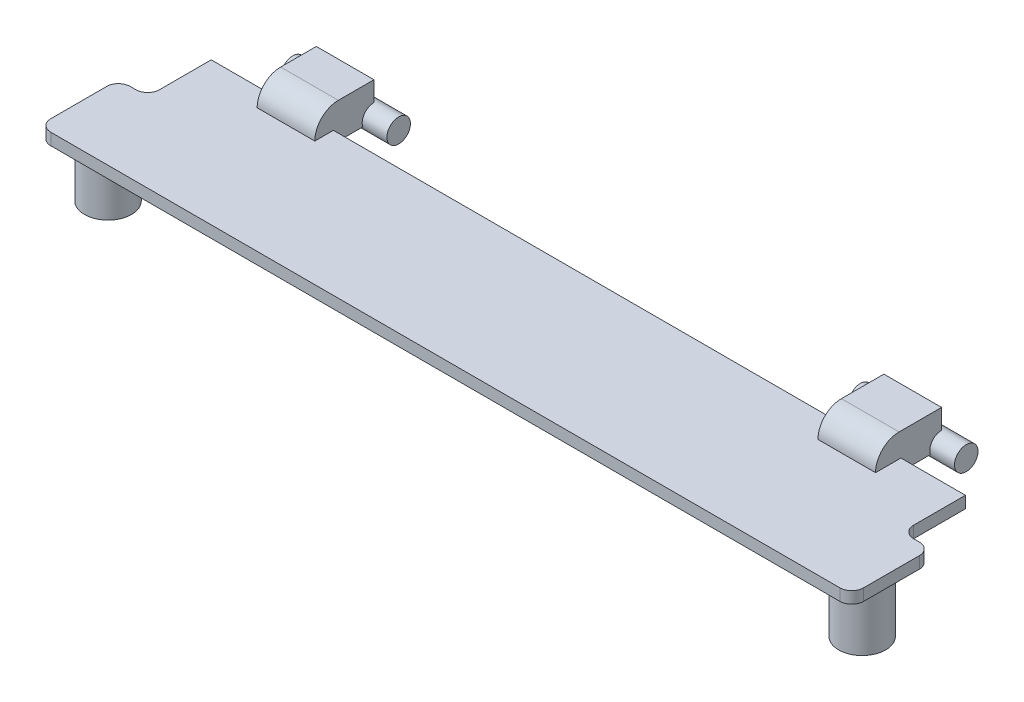
ISO-10303-21;
HEADER;
FILE_DESCRIPTION(('STEP AP214'),'2;1');
FILE_NAME('part.step','',(''),(''),'','','');
FILE_SCHEMA(('AUTOMOTIVE_DESIGN { 1 0 10303 214 1 1 1 1 }'));
ENDSEC;
DATA;
#1=APPLICATION_CONTEXT('core data for automotive mechanical design processes');
#2=APPLICATION_PROTOCOL_DEFINITION('international standard','automotive_design',2000,#1);
#3=PRODUCT_CONTEXT('',#1,'mechanical');
#4=PRODUCT('Part','Part','',(#3));
#5=PRODUCT_RELATED_PRODUCT_CATEGORY('part','',(#4));
#6=PRODUCT_DEFINITION_FORMATION('','',#4);
#7=PRODUCT_DEFINITION_CONTEXT('part definition',#1,'design');
#8=PRODUCT_DEFINITION('design','',#6,#7);
#9=PRODUCT_DEFINITION_SHAPE('','',#8);
#10=(LENGTH_UNIT() NAMED_UNIT(*) SI_UNIT(.MILLI.,.METRE.));
#11=(NAMED_UNIT(*) PLANE_ANGLE_UNIT() SI_UNIT($,.RADIAN.));
#12=(NAMED_UNIT(*) SI_UNIT($,.STERADIAN.) SOLID_ANGLE_UNIT());
#13=UNCERTAINTY_MEASURE_WITH_UNIT(LENGTH_MEASURE(1.E-05),#10,'distance_accuracy_value','');
#14=(GEOMETRIC_REPRESENTATION_CONTEXT(3) GLOBAL_UNCERTAINTY_ASSIGNED_CONTEXT((#13)) GLOBAL_UNIT_ASSIGNED_CONTEXT((#10,
#11,#12)) REPRESENTATION_CONTEXT('',''));
#15=CARTESIAN_POINT('',(0.,0.,0.));
#16=DIRECTION('',(0.,0.,1.));
#17=DIRECTION('',(1.,0.,0.));
#18=AXIS2_PLACEMENT_3D('',#15,#16,#17);
#19=CARTESIAN_POINT('',(0.,6.,-8.77306747824622));
#20=DIRECTION('',(0.,0.,1.));
#21=DIRECTION('',(1.,0.,0.));
#22=AXIS2_PLACEMENT_3D('',#19,#20,#21);
#23=PLANE('',#22);
#24=DIRECTION('',(-1.,0.,0.));
#25=VECTOR('',#24,1.);
#26=CARTESIAN_POINT('',(0.,6.,-8.77306747824622));
#27=LINE('',#26,#25);
#28=CARTESIAN_POINT('',(53.72,6.,-8.77306747824622));
#29=VERTEX_POINT('',#28);
#30=CARTESIAN_POINT('',(10.38,6.,-8.77306747824622));
#31=VERTEX_POINT('',#30);
#32=EDGE_CURVE('E284',#29,#31,#27,.T.);
#33=ORIENTED_EDGE('',*,*,#32,.F.);
#34=DIRECTION('',(0.,-1.,0.));
#35=VECTOR('',#34,1.);
#36=CARTESIAN_POINT('',(53.72,6.,-8.77306747824622));
#37=LINE('',#36,#35);
#38=CARTESIAN_POINT('',(53.72,5.,-8.77306747824622));
#39=VERTEX_POINT('',#38);
#40=EDGE_CURVE('E486',#29,#39,#37,.T.);
#41=ORIENTED_EDGE('',*,*,#40,.T.);
#42=DIRECTION('',(-1.,0.,0.));
#43=VECTOR('',#42,1.);
#44=CARTESIAN_POINT('',(0.,5.,-8.77306747824622));
#45=LINE('',#44,#43);
#46=CARTESIAN_POINT('',(10.38,5.,-8.77306747824622));
#47=VERTEX_POINT('',#46);
#48=EDGE_CURVE('E334',#39,#47,#45,.T.);
#49=ORIENTED_EDGE('',*,*,#48,.T.);
#50=DIRECTION('',(0.,1.,0.));
#51=VECTOR('',#50,1.);
#52=CARTESIAN_POINT('',(10.38,6.,-8.77306747824622));
#53=LINE('',#52,#51);
#54=EDGE_CURVE('E285',#47,#31,#53,.T.);
#55=ORIENTED_EDGE('',*,*,#54,.T.);
#56=EDGE_LOOP('',(#33,#41,#49,#55));
#57=FACE_BOUND('',#56,.T.);
#58=ADVANCED_FACE('F41',(#57),#23,.F.);
#59=CARTESIAN_POINT('',(64.1,5.,-8.77306747824622));
#60=VERTEX_POINT('',#59);
#61=CARTESIAN_POINT('',(58.62,5.,-8.77306747824622));
#62=VERTEX_POINT('',#61);
#63=EDGE_CURVE('E330',#60,#62,#45,.T.);
#64=ORIENTED_EDGE('',*,*,#63,.T.);
#65=DIRECTION('',(0.,1.,0.));
#66=VECTOR('',#65,1.);
#67=CARTESIAN_POINT('',(58.62,6.,-8.77306747824622));
#68=LINE('',#67,#66);
#69=CARTESIAN_POINT('',(58.62,6.,-8.77306747824622));
#70=VERTEX_POINT('',#69);
#71=EDGE_CURVE('E533',#62,#70,#68,.T.);
#72=ORIENTED_EDGE('',*,*,#71,.T.);
#73=CARTESIAN_POINT('',(64.1,6.,-8.77306747824622));
#74=VERTEX_POINT('',#73);
#75=EDGE_CURVE('E306',#74,#70,#27,.T.);
#76=ORIENTED_EDGE('',*,*,#75,.F.);
#77=DIRECTION('',(0.,-1.,0.));
#78=VECTOR('',#77,1.);
#79=CARTESIAN_POINT('',(64.1,6.,-8.77306747824622));
#80=LINE('',#79,#78);
#81=EDGE_CURVE('E353',#74,#60,#80,.T.);
#82=ORIENTED_EDGE('',*,*,#81,.T.);
#83=EDGE_LOOP('',(#64,#72,#76,#82));
#84=FACE_BOUND('',#83,.T.);
#85=ADVANCED_FACE('F558',(#84),#23,.F.);
#86=CARTESIAN_POINT('',(64.1,5.,0.));
#87=DIRECTION('',(0.,-1.,0.));
#88=DIRECTION('',(0.,0.,-1.));
#89=AXIS2_PLACEMENT_3D('',#86,#87,#88);
#90=CYLINDRICAL_SURFACE('',#89,2.);
#91=CARTESIAN_POINT('',(64.1,5.,0.));
#92=DIRECTION('',(0.,1.,0.));
#93=DIRECTION('',(0.,0.,1.));
#94=AXIS2_PLACEMENT_3D('',#91,#92,#93);
#95=CIRCLE('',#94,2.);
#96=CARTESIAN_POINT('',(64.1,5.,2.));
#97=VERTEX_POINT('',#96);
#98=EDGE_CURVE('E357',#97,#97,#95,.T.);
#99=ORIENTED_EDGE('',*,*,#98,.F.);
#100=EDGE_LOOP('',(#99));
#101=FACE_BOUND('',#100,.T.);
#102=CARTESIAN_POINT('',(64.1,0.,0.));
#103=DIRECTION('',(0.,1.,0.));
#104=DIRECTION('',(0.,0.,1.));
#105=AXIS2_PLACEMENT_3D('',#102,#103,#104);
#106=CIRCLE('',#105,2.);
#107=CARTESIAN_POINT('',(64.1,0.,2.));
#108=VERTEX_POINT('',#107);
#109=EDGE_CURVE('E356',#108,#108,#106,.T.);
#110=ORIENTED_EDGE('',*,*,#109,.T.);
#111=EDGE_LOOP('',(#110));
#112=FACE_BOUND('',#111,.T.);
#113=ADVANCED_FACE('F564',(#101,#112),#90,.T.);
#114=CARTESIAN_POINT('',(64.1,0.,0.));
#115=DIRECTION('',(0.,1.,0.));
#116=DIRECTION('',(0.,0.,1.));
#117=AXIS2_PLACEMENT_3D('',#114,#115,#116);
#118=PLANE('',#117);
#119=ORIENTED_EDGE('',*,*,#109,.F.);
#120=EDGE_LOOP('',(#119));
#121=FACE_BOUND('',#120,.T.);
#122=ADVANCED_FACE('F572',(#121),#118,.F.);
#123=CARTESIAN_POINT('',(64.1,6.,-3.37306747824622));
#124=DIRECTION('',(-1.,0.,0.));
#125=DIRECTION('',(0.,0.,1.));
#126=AXIS2_PLACEMENT_3D('',#123,#124,#125);
#127=PLANE('',#126);
#128=DIRECTION('',(0.,0.,-1.));
#129=VECTOR('',#128,1.);
#130=CARTESIAN_POINT('',(64.1,6.,-3.37306747824622));
#131=LINE('',#130,#129);
#132=CARTESIAN_POINT('',(64.1,6.,-4.37306747824622));
#133=VERTEX_POINT('',#132);
#134=EDGE_CURVE('E302',#133,#74,#131,.T.);
#135=ORIENTED_EDGE('',*,*,#134,.F.);
#136=DIRECTION('',(0.,-1.,0.));
#137=VECTOR('',#136,1.);
#138=CARTESIAN_POINT('',(64.1,5.,-4.37306747824622));
#139=LINE('',#138,#137);
#140=CARTESIAN_POINT('',(64.1,5.,-4.37306747824622));
#141=VERTEX_POINT('',#140);
#142=EDGE_CURVE('E369',#133,#141,#139,.T.);
#143=ORIENTED_EDGE('',*,*,#142,.T.);
#144=DIRECTION('',(0.,0.,-1.));
#145=VECTOR('',#144,1.);
#146=CARTESIAN_POINT('',(64.1,5.,-3.37306747824622));
#147=LINE('',#146,#145);
#148=EDGE_CURVE('E299',#141,#60,#147,.T.);
#149=ORIENTED_EDGE('',*,*,#148,.T.);
#150=ORIENTED_EDGE('',*,*,#81,.F.);
#151=EDGE_LOOP('',(#135,#143,#149,#150));
#152=FACE_BOUND('',#151,.T.);
#153=ADVANCED_FACE('F422',(#152),#127,.F.);
#154=CARTESIAN_POINT('',(5.48,6.,-8.77306747824622));
#155=VERTEX_POINT('',#154);
#156=CARTESIAN_POINT('',(0.,6.,-8.77306747824622));
#157=VERTEX_POINT('',#156);
#158=EDGE_CURVE('E304',#155,#157,#27,.T.);
#159=ORIENTED_EDGE('',*,*,#158,.F.);
#160=DIRECTION('',(0.,-1.,0.));
#161=VECTOR('',#160,1.);
#162=CARTESIAN_POINT('',(5.48,6.,-8.77306747824622));
#163=LINE('',#162,#161);
#164=CARTESIAN_POINT('',(5.48,5.,-8.77306747824622));
#165=VERTEX_POINT('',#164);
#166=EDGE_CURVE('E287',#155,#165,#163,.T.);
#167=ORIENTED_EDGE('',*,*,#166,.T.);
#168=CARTESIAN_POINT('',(0.,5.,-8.77306747824622));
#169=VERTEX_POINT('',#168);
#170=EDGE_CURVE('E329',#165,#169,#45,.T.);
#171=ORIENTED_EDGE('',*,*,#170,.T.);
#172=DIRECTION('',(0.,-1.,0.));
#173=VECTOR('',#172,1.);
#174=CARTESIAN_POINT('',(0.,6.,-8.77306747824622));
#175=LINE('',#174,#173);
#176=EDGE_CURVE('E327',#157,#169,#175,.T.);
#177=ORIENTED_EDGE('',*,*,#176,.F.);
#178=EDGE_LOOP('',(#159,#167,#171,#177));
#179=FACE_BOUND('',#178,.T.);
#180=ADVANCED_FACE('F481',(#179),#23,.F.);
#181=CARTESIAN_POINT('',(0.,6.,-3.37306747824622));
#182=DIRECTION('',(1.,0.,0.));
#183=DIRECTION('',(0.,0.,-1.));
#184=AXIS2_PLACEMENT_3D('',#181,#182,#183);
#185=PLANE('',#184);
#186=DIRECTION('',(0.,0.,1.));
#187=VECTOR('',#186,1.);
#188=CARTESIAN_POINT('',(0.,5.,-3.37306747824622));
#189=LINE('',#188,#187);
#190=CARTESIAN_POINT('',(0.,5.,-4.37306747824622));
#191=VERTEX_POINT('',#190);
#192=EDGE_CURVE('E333',#169,#191,#189,.T.);
#193=ORIENTED_EDGE('',*,*,#192,.T.);
#194=DIRECTION('',(0.,-1.,0.));
#195=VECTOR('',#194,1.);
#196=CARTESIAN_POINT('',(0.,6.,-4.37306747824622));
#197=LINE('',#196,#195);
#198=CARTESIAN_POINT('',(0.,6.,-4.37306747824622));
#199=VERTEX_POINT('',#198);
#200=EDGE_CURVE('E367',#191,#199,#197,.F.);
#201=ORIENTED_EDGE('',*,*,#200,.T.);
#202=DIRECTION('',(0.,0.,1.));
#203=VECTOR('',#202,1.);
#204=CARTESIAN_POINT('',(0.,6.,-3.37306747824622));
#205=LINE('',#204,#203);
#206=EDGE_CURVE('E309',#157,#199,#205,.T.);
#207=ORIENTED_EDGE('',*,*,#206,.F.);
#208=ORIENTED_EDGE('',*,*,#176,.T.);
#209=EDGE_LOOP('',(#193,#201,#207,#208));
#210=FACE_BOUND('',#209,.T.);
#211=ADVANCED_FACE('F476',(#210),#185,.F.);
#212=CARTESIAN_POINT('',(0.,6.,-3.37306747824622));
#213=DIRECTION('',(0.,0.,1.));
#214=DIRECTION('',(1.,0.,0.));
#215=AXIS2_PLACEMENT_3D('',#212,#213,#214);
#216=PLANE('',#215);
#217=DIRECTION('',(-1.,0.,0.));
#218=VECTOR('',#217,1.);
#219=CARTESIAN_POINT('',(0.,6.,-3.37306747824622));
#220=LINE('',#219,#218);
#221=CARTESIAN_POINT('',(-1.,6.,-3.37306747824622));
#222=VERTEX_POINT('',#221);
#223=CARTESIAN_POINT('',(-1.48537182716466,6.,-3.37306747824622));
#224=VERTEX_POINT('',#223);
#225=EDGE_CURVE('E312',#222,#224,#220,.T.);
#226=ORIENTED_EDGE('',*,*,#225,.F.);
#227=DIRECTION('',(0.,-1.,0.));
#228=VECTOR('',#227,1.);
#229=CARTESIAN_POINT('',(-1.,5.,-3.37306747824622));
#230=LINE('',#229,#228);
#231=CARTESIAN_POINT('',(-1.,5.,-3.37306747824622));
#232=VERTEX_POINT('',#231);
#233=EDGE_CURVE('E364',#222,#232,#230,.T.);
#234=ORIENTED_EDGE('',*,*,#233,.T.);
#235=DIRECTION('',(-1.,0.,0.));
#236=VECTOR('',#235,1.);
#237=CARTESIAN_POINT('',(0.,5.,-3.37306747824622));
#238=LINE('',#237,#236);
#239=CARTESIAN_POINT('',(-1.48537182716466,5.,-3.37306747824622));
#240=VERTEX_POINT('',#239);
#241=EDGE_CURVE('E337',#232,#240,#238,.T.);
#242=ORIENTED_EDGE('',*,*,#241,.T.);
#243=DIRECTION('',(0.,-1.,0.));
#244=VECTOR('',#243,1.);
#245=CARTESIAN_POINT('',(-1.48537182716466,6.,-3.37306747824622));
#246=LINE('',#245,#244);
#247=EDGE_CURVE('E360',#240,#224,#246,.F.);
#248=ORIENTED_EDGE('',*,*,#247,.T.);
#249=EDGE_LOOP('',(#226,#234,#242,#248));
#250=FACE_BOUND('',#249,.T.);
#251=ADVANCED_FACE('F467',(#250),#216,.F.);
#252=CARTESIAN_POINT('',(-2.48537182716466,6.,3.37306747824622));
#253=DIRECTION('',(1.,0.,0.));
#254=DIRECTION('',(0.,0.,-1.));
#255=AXIS2_PLACEMENT_3D('',#252,#253,#254);
#256=PLANE('',#255);
#257=DIRECTION('',(0.,0.,1.));
#258=VECTOR('',#257,1.);
#259=CARTESIAN_POINT('',(-2.48537182716466,5.,3.37306747824622));
#260=LINE('',#259,#258);
#261=CARTESIAN_POINT('',(-2.48537182716466,5.,-2.37306747824622));
#262=VERTEX_POINT('',#261);
#263=CARTESIAN_POINT('',(-2.48537182716466,5.,2.37306747824622));
#264=VERTEX_POINT('',#263);
#265=EDGE_CURVE('E340',#262,#264,#260,.T.);
#266=ORIENTED_EDGE('',*,*,#265,.T.);
#267=DIRECTION('',(0.,-1.,0.));
#268=VECTOR('',#267,1.);
#269=CARTESIAN_POINT('',(-2.48537182716466,6.,2.37306747824622));
#270=LINE('',#269,#268);
#271=CARTESIAN_POINT('',(-2.48537182716466,6.,2.37306747824622));
#272=VERTEX_POINT('',#271);
#273=EDGE_CURVE('E406',#264,#272,#270,.F.);
#274=ORIENTED_EDGE('',*,*,#273,.T.);
#275=DIRECTION('',(0.,0.,1.));
#276=VECTOR('',#275,1.);
#277=CARTESIAN_POINT('',(-2.48537182716466,6.,3.37306747824622));
#278=LINE('',#277,#276);
#279=CARTESIAN_POINT('',(-2.48537182716466,6.,-2.37306747824622));
#280=VERTEX_POINT('',#279);
#281=EDGE_CURVE('E315',#280,#272,#278,.T.);
#282=ORIENTED_EDGE('',*,*,#281,.F.);
#283=DIRECTION('',(0.,-1.,0.));
#284=VECTOR('',#283,1.);
#285=CARTESIAN_POINT('',(-2.48537182716466,6.,-2.37306747824622));
#286=LINE('',#285,#284);
#287=EDGE_CURVE('E403',#280,#262,#286,.T.);
#288=ORIENTED_EDGE('',*,*,#287,.T.);
#289=EDGE_LOOP('',(#266,#274,#282,#288));
#290=FACE_BOUND('',#289,.T.);
#291=ADVANCED_FACE('F457',(#290),#256,.F.);
#292=CARTESIAN_POINT('',(66.5853718271646,6.,3.37306747824622));
#293=DIRECTION('',(0.,0.,-1.));
#294=DIRECTION('',(-1.,0.,0.));
#295=AXIS2_PLACEMENT_3D('',#292,#293,#294);
#296=PLANE('',#295);
#297=DIRECTION('',(1.,0.,0.));
#298=VECTOR('',#297,1.);
#299=CARTESIAN_POINT('',(66.5853718271646,5.,3.37306747824622));
#300=LINE('',#299,#298);
#301=CARTESIAN_POINT('',(-1.48537182716467,5.,3.37306747824622));
#302=VERTEX_POINT('',#301);
#303=CARTESIAN_POINT('',(65.5853718271646,5.,3.37306747824622));
#304=VERTEX_POINT('',#303);
#305=EDGE_CURVE('E343',#302,#304,#300,.T.);
#306=ORIENTED_EDGE('',*,*,#305,.T.);
#307=DIRECTION('',(0.,-1.,0.));
#308=VECTOR('',#307,1.);
#309=CARTESIAN_POINT('',(65.5853718271646,6.,3.37306747824622));
#310=LINE('',#309,#308);
#311=CARTESIAN_POINT('',(65.5853718271646,6.,3.37306747824622));
#312=VERTEX_POINT('',#311);
#313=EDGE_CURVE('E401',#304,#312,#310,.F.);
#314=ORIENTED_EDGE('',*,*,#313,.T.);
#315=DIRECTION('',(1.,0.,0.));
#316=VECTOR('',#315,1.);
#317=CARTESIAN_POINT('',(66.5853718271646,6.,3.37306747824622));
#318=LINE('',#317,#316);
#319=CARTESIAN_POINT('',(-1.48537182716467,6.,3.37306747824622));
#320=VERTEX_POINT('',#319);
#321=EDGE_CURVE('E318',#320,#312,#318,.T.);
#322=ORIENTED_EDGE('',*,*,#321,.F.);
#323=DIRECTION('',(0.,-1.,0.));
#324=VECTOR('',#323,1.);
#325=CARTESIAN_POINT('',(-1.48537182716467,6.,3.37306747824622));
#326=LINE('',#325,#324);
#327=EDGE_CURVE('E398',#320,#302,#326,.T.);
#328=ORIENTED_EDGE('',*,*,#327,.T.);
#329=EDGE_LOOP('',(#306,#314,#322,#328));
#330=FACE_BOUND('',#329,.T.);
#331=ADVANCED_FACE('F448',(#330),#296,.F.);
#332=CARTESIAN_POINT('',(66.5853718271646,6.,3.37306747824622));
#333=DIRECTION('',(-1.,0.,0.));
#334=DIRECTION('',(0.,0.,1.));
#335=AXIS2_PLACEMENT_3D('',#332,#333,#334);
#336=PLANE('',#335);
#337=DIRECTION('',(0.,0.,-1.));
#338=VECTOR('',#337,1.);
#339=CARTESIAN_POINT('',(66.5853718271646,5.,3.37306747824622));
#340=LINE('',#339,#338);
#341=CARTESIAN_POINT('',(66.5853718271646,5.,2.37306747824622));
#342=VERTEX_POINT('',#341);
#343=CARTESIAN_POINT('',(66.5853718271646,5.,-2.37306747824622));
#344=VERTEX_POINT('',#343);
#345=EDGE_CURVE('E346',#342,#344,#340,.T.);
#346=ORIENTED_EDGE('',*,*,#345,.T.);
#347=DIRECTION('',(0.,-1.,0.));
#348=VECTOR('',#347,1.);
#349=CARTESIAN_POINT('',(66.5853718271646,6.,-2.37306747824622));
#350=LINE('',#349,#348);
#351=CARTESIAN_POINT('',(66.5853718271646,6.,-2.37306747824622));
#352=VERTEX_POINT('',#351);
#353=EDGE_CURVE('E388',#344,#352,#350,.F.);
#354=ORIENTED_EDGE('',*,*,#353,.T.);
#355=DIRECTION('',(0.,0.,-1.));
#356=VECTOR('',#355,1.);
#357=CARTESIAN_POINT('',(66.5853718271646,6.,3.37306747824622));
#358=LINE('',#357,#356);
#359=CARTESIAN_POINT('',(66.5853718271646,6.,2.37306747824622));
#360=VERTEX_POINT('',#359);
#361=EDGE_CURVE('E321',#360,#352,#358,.T.);
#362=ORIENTED_EDGE('',*,*,#361,.F.);
#363=DIRECTION('',(0.,-1.,0.));
#364=VECTOR('',#363,1.);
#365=CARTESIAN_POINT('',(66.5853718271646,6.,2.37306747824622));
#366=LINE('',#365,#364);
#367=EDGE_CURVE('E385',#360,#342,#366,.T.);
#368=ORIENTED_EDGE('',*,*,#367,.T.);
#369=EDGE_LOOP('',(#346,#354,#362,#368));
#370=FACE_BOUND('',#369,.T.);
#371=ADVANCED_FACE('F439',(#370),#336,.F.);
#372=CARTESIAN_POINT('',(66.5853718271646,6.,-3.37306747824622));
#373=DIRECTION('',(0.,0.,1.));
#374=DIRECTION('',(1.,0.,0.));
#375=AXIS2_PLACEMENT_3D('',#372,#373,#374);
#376=PLANE('',#375);
#377=DIRECTION('',(-1.,0.,0.));
#378=VECTOR('',#377,1.);
#379=CARTESIAN_POINT('',(66.5853718271646,5.,-3.37306747824622));
#380=LINE('',#379,#378);
#381=CARTESIAN_POINT('',(65.5853718271646,5.,-3.37306747824622));
#382=VERTEX_POINT('',#381);
#383=CARTESIAN_POINT('',(65.1,5.,-3.37306747824622));
#384=VERTEX_POINT('',#383);
#385=EDGE_CURVE('E305',#382,#384,#380,.T.);
#386=ORIENTED_EDGE('',*,*,#385,.T.);
#387=DIRECTION('',(0.,-1.,0.));
#388=VECTOR('',#387,1.);
#389=CARTESIAN_POINT('',(65.1,6.,-3.37306747824622));
#390=LINE('',#389,#388);
#391=CARTESIAN_POINT('',(65.1,6.,-3.37306747824622));
#392=VERTEX_POINT('',#391);
#393=EDGE_CURVE('E375',#384,#392,#390,.F.);
#394=ORIENTED_EDGE('',*,*,#393,.T.);
#395=DIRECTION('',(-1.,0.,0.));
#396=VECTOR('',#395,1.);
#397=CARTESIAN_POINT('',(66.5853718271646,6.,-3.37306747824622));
#398=LINE('',#397,#396);
#399=CARTESIAN_POINT('',(65.5853718271646,6.,-3.37306747824622));
#400=VERTEX_POINT('',#399);
#401=EDGE_CURVE('E324',#400,#392,#398,.T.);
#402=ORIENTED_EDGE('',*,*,#401,.F.);
#403=DIRECTION('',(0.,-1.,0.));
#404=VECTOR('',#403,1.);
#405=CARTESIAN_POINT('',(65.5853718271646,6.,-3.37306747824622));
#406=LINE('',#405,#404);
#407=EDGE_CURVE('E372',#400,#382,#406,.T.);
#408=ORIENTED_EDGE('',*,*,#407,.T.);
#409=EDGE_LOOP('',(#386,#394,#402,#408));
#410=FACE_BOUND('',#409,.T.);
#411=ADVANCED_FACE('F431',(#410),#376,.F.);
#412=CARTESIAN_POINT('',(0.,6.,0.));
#413=DIRECTION('',(0.,-1.,0.));
#414=DIRECTION('',(0.,0.,-1.));
#415=AXIS2_PLACEMENT_3D('',#412,#413,#414);
#416=PLANE('',#415);
#417=DIRECTION('',(-1.,0.,0.));
#418=VECTOR('',#417,1.);
#419=CARTESIAN_POINT('',(0.,6.,-6.61597771409182));
#420=LINE('',#419,#418);
#421=CARTESIAN_POINT('',(58.62,6.,-6.61597771409183));
#422=VERTEX_POINT('',#421);
#423=CARTESIAN_POINT('',(53.72,6.,-6.61597771409183));
#424=VERTEX_POINT('',#423);
#425=EDGE_CURVE('E527',#422,#424,#420,.T.);
#426=ORIENTED_EDGE('',*,*,#425,.T.);
#427=DIRECTION('',(0.,0.,-1.));
#428=VECTOR('',#427,1.);
#429=CARTESIAN_POINT('',(53.72,6.,0.));
#430=LINE('',#429,#428);
#431=EDGE_CURVE('E536',#424,#29,#430,.T.);
#432=ORIENTED_EDGE('',*,*,#431,.T.);
#433=ORIENTED_EDGE('',*,*,#32,.T.);
#434=DIRECTION('',(0.,0.,1.));
#435=VECTOR('',#434,1.);
#436=CARTESIAN_POINT('',(10.38,6.,0.));
#437=LINE('',#436,#435);
#438=CARTESIAN_POINT('',(10.38,6.,-7.19530993931775));
#439=VERTEX_POINT('',#438);
#440=EDGE_CURVE('E272',#31,#439,#437,.T.);
#441=ORIENTED_EDGE('',*,*,#440,.T.);
#442=DIRECTION('',(-1.,0.,0.));
#443=VECTOR('',#442,1.);
#444=CARTESIAN_POINT('',(0.,6.,-7.19530993931775));
#445=LINE('',#444,#443);
#446=CARTESIAN_POINT('',(5.48,6.,-7.19530993931775));
#447=VERTEX_POINT('',#446);
#448=EDGE_CURVE('E281',#439,#447,#445,.T.);
#449=ORIENTED_EDGE('',*,*,#448,.T.);
#450=DIRECTION('',(0.,0.,-1.));
#451=VECTOR('',#450,1.);
#452=CARTESIAN_POINT('',(5.48,6.,0.));
#453=LINE('',#452,#451);
#454=EDGE_CURVE('E290',#447,#155,#453,.T.);
#455=ORIENTED_EDGE('',*,*,#454,.T.);
#456=ORIENTED_EDGE('',*,*,#158,.T.);
#457=ORIENTED_EDGE('',*,*,#206,.T.);
#458=CARTESIAN_POINT('',(-1.,6.,-4.37306747824622));
#459=DIRECTION('',(0.,-1.,0.));
#460=DIRECTION('',(0.,0.,-1.));
#461=AXIS2_PLACEMENT_3D('',#458,#459,#460);
#462=CIRCLE('',#461,1.);
#463=EDGE_CURVE('E410',#199,#222,#462,.T.);
#464=ORIENTED_EDGE('',*,*,#463,.T.);
#465=ORIENTED_EDGE('',*,*,#225,.T.);
#466=CARTESIAN_POINT('',(-1.48537182716466,6.,-2.37306747824622));
#467=DIRECTION('',(0.,-1.,0.));
#468=DIRECTION('',(0.,0.,-1.));
#469=AXIS2_PLACEMENT_3D('',#466,#467,#468);
#470=CIRCLE('',#469,1.);
#471=EDGE_CURVE('E390',#224,#280,#470,.F.);
#472=ORIENTED_EDGE('',*,*,#471,.T.);
#473=ORIENTED_EDGE('',*,*,#281,.T.);
#474=CARTESIAN_POINT('',(-1.48537182716467,6.,2.37306747824622));
#475=DIRECTION('',(0.,-1.,0.));
#476=DIRECTION('',(0.,0.,-1.));
#477=AXIS2_PLACEMENT_3D('',#474,#475,#476);
#478=CIRCLE('',#477,1.);
#479=EDGE_CURVE('E392',#272,#320,#478,.F.);
#480=ORIENTED_EDGE('',*,*,#479,.T.);
#481=ORIENTED_EDGE('',*,*,#321,.T.);
#482=CARTESIAN_POINT('',(65.5853718271646,6.,2.37306747824622));
#483=DIRECTION('',(0.,-1.,0.));
#484=DIRECTION('',(0.,0.,-1.));
#485=AXIS2_PLACEMENT_3D('',#482,#483,#484);
#486=CIRCLE('',#485,1.);
#487=EDGE_CURVE('E394',#312,#360,#486,.F.);
#488=ORIENTED_EDGE('',*,*,#487,.T.);
#489=ORIENTED_EDGE('',*,*,#361,.T.);
#490=CARTESIAN_POINT('',(65.5853718271646,6.,-2.37306747824622));
#491=DIRECTION('',(0.,-1.,0.));
#492=DIRECTION('',(0.,0.,-1.));
#493=AXIS2_PLACEMENT_3D('',#490,#491,#492);
#494=CIRCLE('',#493,1.);
#495=EDGE_CURVE('E396',#352,#400,#494,.F.);
#496=ORIENTED_EDGE('',*,*,#495,.T.);
#497=ORIENTED_EDGE('',*,*,#401,.T.);
#498=CARTESIAN_POINT('',(65.1,6.,-4.37306747824622));
#499=DIRECTION('',(0.,-1.,0.));
#500=DIRECTION('',(0.,0.,-1.));
#501=AXIS2_PLACEMENT_3D('',#498,#499,#500);
#502=CIRCLE('',#501,1.);
#503=EDGE_CURVE('E258',#392,#133,#502,.T.);
#504=ORIENTED_EDGE('',*,*,#503,.T.);
#505=ORIENTED_EDGE('',*,*,#134,.T.);
#506=ORIENTED_EDGE('',*,*,#75,.T.);
#507=DIRECTION('',(0.,0.,1.));
#508=VECTOR('',#507,1.);
#509=CARTESIAN_POINT('',(58.62,6.,0.));
#510=LINE('',#509,#508);
#511=EDGE_CURVE('E530',#70,#422,#510,.T.);
#512=ORIENTED_EDGE('',*,*,#511,.T.);
#513=EDGE_LOOP('',(#426,#432,#433,#441,#449,#455,#456,#457,#464,#465,#472,#473,#480,#481,#488,
#489,#496,#497,#504,#505,#506,#512));
#514=FACE_BOUND('',#513,.T.);
#515=ADVANCED_FACE('F279',(#514),#416,.F.);
#516=CARTESIAN_POINT('',(0.,5.,0.));
#517=DIRECTION('',(0.,-1.,0.));
#518=DIRECTION('',(0.,0.,-1.));
#519=AXIS2_PLACEMENT_3D('',#516,#517,#518);
#520=PLANE('',#519);
#521=DIRECTION('',(-1.,0.,0.));
#522=VECTOR('',#521,1.);
#523=CARTESIAN_POINT('',(60.72,5.,-11.2767391200167));
#524=LINE('',#523,#522);
#525=CARTESIAN_POINT('',(58.62,5.,-11.2767391200167));
#526=VERTEX_POINT('',#525);
#527=CARTESIAN_POINT('',(53.72,5.,-11.2767391200167));
#528=VERTEX_POINT('',#527);
#529=EDGE_CURVE('E613',#526,#528,#524,.T.);
#530=ORIENTED_EDGE('',*,*,#529,.F.);
#531=DIRECTION('',(0.,0.,-1.));
#532=VECTOR('',#531,1.);
#533=CARTESIAN_POINT('',(58.62,5.,-6.61597771409183));
#534=LINE('',#533,#532);
#535=EDGE_CURVE('E236',#62,#526,#534,.T.);
#536=ORIENTED_EDGE('',*,*,#535,.F.);
#537=ORIENTED_EDGE('',*,*,#63,.F.);
#538=ORIENTED_EDGE('',*,*,#148,.F.);
#539=CARTESIAN_POINT('',(65.1,5.,-4.37306747824622));
#540=DIRECTION('',(0.,-1.,0.));
#541=DIRECTION('',(0.,0.,-1.));
#542=AXIS2_PLACEMENT_3D('',#539,#540,#541);
#543=CIRCLE('',#542,1.);
#544=EDGE_CURVE('E412',#141,#384,#543,.F.);
#545=ORIENTED_EDGE('',*,*,#544,.T.);
#546=ORIENTED_EDGE('',*,*,#385,.F.);
#547=CARTESIAN_POINT('',(65.5853718271646,5.,-2.37306747824622));
#548=DIRECTION('',(0.,-1.,0.));
#549=DIRECTION('',(0.,0.,-1.));
#550=AXIS2_PLACEMENT_3D('',#547,#548,#549);
#551=CIRCLE('',#550,1.);
#552=EDGE_CURVE('E383',#382,#344,#551,.T.);
#553=ORIENTED_EDGE('',*,*,#552,.T.);
#554=ORIENTED_EDGE('',*,*,#345,.F.);
#555=CARTESIAN_POINT('',(65.5853718271646,5.,2.37306747824622));
#556=DIRECTION('',(0.,-1.,0.));
#557=DIRECTION('',(0.,0.,-1.));
#558=AXIS2_PLACEMENT_3D('',#555,#556,#557);
#559=CIRCLE('',#558,1.);
#560=EDGE_CURVE('E381',#342,#304,#559,.T.);
#561=ORIENTED_EDGE('',*,*,#560,.T.);
#562=ORIENTED_EDGE('',*,*,#305,.F.);
#563=CARTESIAN_POINT('',(-1.48537182716467,5.,2.37306747824622));
#564=DIRECTION('',(0.,-1.,0.));
#565=DIRECTION('',(0.,0.,-1.));
#566=AXIS2_PLACEMENT_3D('',#563,#564,#565);
#567=CIRCLE('',#566,1.);
#568=EDGE_CURVE('E379',#302,#264,#567,.T.);
#569=ORIENTED_EDGE('',*,*,#568,.T.);
#570=ORIENTED_EDGE('',*,*,#265,.F.);
#571=CARTESIAN_POINT('',(-1.48537182716466,5.,-2.37306747824622));
#572=DIRECTION('',(0.,-1.,0.));
#573=DIRECTION('',(0.,0.,-1.));
#574=AXIS2_PLACEMENT_3D('',#571,#572,#573);
#575=CIRCLE('',#574,1.);
#576=EDGE_CURVE('E377',#262,#240,#575,.T.);
#577=ORIENTED_EDGE('',*,*,#576,.T.);
#578=ORIENTED_EDGE('',*,*,#241,.F.);
#579=CARTESIAN_POINT('',(-1.,5.,-4.37306747824622));
#580=DIRECTION('',(0.,-1.,0.));
#581=DIRECTION('',(0.,0.,-1.));
#582=AXIS2_PLACEMENT_3D('',#579,#580,#581);
#583=CIRCLE('',#582,1.);
#584=EDGE_CURVE('E408',#232,#191,#583,.F.);
#585=ORIENTED_EDGE('',*,*,#584,.T.);
#586=ORIENTED_EDGE('',*,*,#192,.F.);
#587=ORIENTED_EDGE('',*,*,#170,.F.);
#588=DIRECTION('',(0.,0.,1.));
#589=VECTOR('',#588,1.);
#590=CARTESIAN_POINT('',(5.48,5.,-7.19530993931775));
#591=LINE('',#590,#589);
#592=CARTESIAN_POINT('',(5.48,5.,-11.2767391200167));
#593=VERTEX_POINT('',#592);
#594=EDGE_CURVE('E495',#593,#165,#591,.T.);
#595=ORIENTED_EDGE('',*,*,#594,.F.);
#596=DIRECTION('',(-1.,0.,0.));
#597=VECTOR('',#596,1.);
#598=CARTESIAN_POINT('',(12.48,5.,-11.2767391200167));
#599=LINE('',#598,#597);
#600=CARTESIAN_POINT('',(10.38,5.,-11.2767391200167));
#601=VERTEX_POINT('',#600);
#602=EDGE_CURVE('E494',#601,#593,#599,.T.);
#603=ORIENTED_EDGE('',*,*,#602,.F.);
#604=DIRECTION('',(0.,0.,-1.));
#605=VECTOR('',#604,1.);
#606=CARTESIAN_POINT('',(10.38,5.,-7.19530993931775));
#607=LINE('',#606,#605);
#608=EDGE_CURVE('E491',#47,#601,#607,.T.);
#609=ORIENTED_EDGE('',*,*,#608,.F.);
#610=ORIENTED_EDGE('',*,*,#48,.F.);
#611=DIRECTION('',(0.,0.,1.));
#612=VECTOR('',#611,1.);
#613=CARTESIAN_POINT('',(53.72,5.,-6.61597771409183));
#614=LINE('',#613,#612);
#615=EDGE_CURVE('E524',#528,#39,#614,.T.);
#616=ORIENTED_EDGE('',*,*,#615,.F.);
#617=EDGE_LOOP('',(#530,#536,#537,#538,#545,#546,#553,#554,#561,#562,#569,#570,#577,#578,#585,
#586,#587,#595,#603,#609,#610,#616));
#618=FACE_BOUND('',#617,.T.);
#619=CARTESIAN_POINT('',(0.,5.,0.));
#620=DIRECTION('',(0.,1.,0.));
#621=DIRECTION('',(0.,0.,1.));
#622=AXIS2_PLACEMENT_3D('',#619,#620,#621);
#623=CIRCLE('',#622,2.);
#624=CARTESIAN_POINT('',(0.,5.,2.));
#625=VERTEX_POINT('',#624);
#626=EDGE_CURVE('E296',#625,#625,#623,.T.);
#627=ORIENTED_EDGE('',*,*,#626,.T.);
#628=EDGE_LOOP('',(#627));
#629=FACE_BOUND('',#628,.T.);
#630=ORIENTED_EDGE('',*,*,#98,.T.);
#631=EDGE_LOOP('',(#630));
#632=FACE_BOUND('',#631,.T.);
#633=ADVANCED_FACE('F427',(#618,#629,#632),#520,.T.);
#634=CARTESIAN_POINT('',(0.,5.,0.));
#635=DIRECTION('',(0.,-1.,0.));
#636=DIRECTION('',(0.,0.,-1.));
#637=AXIS2_PLACEMENT_3D('',#634,#635,#636);
#638=CYLINDRICAL_SURFACE('',#637,2.);
#639=ORIENTED_EDGE('',*,*,#626,.F.);
#640=EDGE_LOOP('',(#639));
#641=FACE_BOUND('',#640,.T.);
#642=CARTESIAN_POINT('',(0.,0.,0.));
#643=DIRECTION('',(0.,1.,0.));
#644=DIRECTION('',(0.,0.,1.));
#645=AXIS2_PLACEMENT_3D('',#642,#643,#644);
#646=CIRCLE('',#645,2.);
#647=CARTESIAN_POINT('',(0.,0.,2.));
#648=VERTEX_POINT('',#647);
#649=EDGE_CURVE('E295',#648,#648,#646,.T.);
#650=ORIENTED_EDGE('',*,*,#649,.T.);
#651=EDGE_LOOP('',(#650));
#652=FACE_BOUND('',#651,.T.);
#653=ADVANCED_FACE('F791',(#641,#652),#638,.T.);
#654=CARTESIAN_POINT('',(0.,0.,0.));
#655=DIRECTION('',(0.,1.,0.));
#656=DIRECTION('',(0.,0.,1.));
#657=AXIS2_PLACEMENT_3D('',#654,#655,#656);
#658=PLANE('',#657);
#659=ORIENTED_EDGE('',*,*,#649,.F.);
#660=EDGE_LOOP('',(#659));
#661=FACE_BOUND('',#660,.T.);
#662=ADVANCED_FACE('F585',(#661),#658,.F.);
#663=CARTESIAN_POINT('',(-1.,6.,-4.37306747824622));
#664=DIRECTION('',(0.,1.,0.));
#665=DIRECTION('',(0.,0.,1.));
#666=AXIS2_PLACEMENT_3D('',#663,#664,#665);
#667=CYLINDRICAL_SURFACE('',#666,1.);
#668=ORIENTED_EDGE('',*,*,#463,.F.);
#669=ORIENTED_EDGE('',*,*,#200,.F.);
#670=ORIENTED_EDGE('',*,*,#584,.F.);
#671=ORIENTED_EDGE('',*,*,#233,.F.);
#672=EDGE_LOOP('',(#668,#669,#670,#671));
#673=FACE_BOUND('',#672,.T.);
#674=ADVANCED_FACE('F471',(#673),#667,.F.);
#675=CARTESIAN_POINT('',(65.1,6.,-4.37306747824622));
#676=DIRECTION('',(0.,1.,0.));
#677=DIRECTION('',(0.,0.,1.));
#678=AXIS2_PLACEMENT_3D('',#675,#676,#677);
#679=CYLINDRICAL_SURFACE('',#678,1.);
#680=ORIENTED_EDGE('',*,*,#503,.F.);
#681=ORIENTED_EDGE('',*,*,#393,.F.);
#682=ORIENTED_EDGE('',*,*,#544,.F.);
#683=ORIENTED_EDGE('',*,*,#142,.F.);
#684=EDGE_LOOP('',(#680,#681,#682,#683));
#685=FACE_BOUND('',#684,.T.);
#686=ADVANCED_FACE('F424',(#685),#679,.F.);
#687=CARTESIAN_POINT('',(65.5853718271646,6.,-2.37306747824622));
#688=DIRECTION('',(0.,-1.,0.));
#689=DIRECTION('',(0.,0.,-1.));
#690=AXIS2_PLACEMENT_3D('',#687,#688,#689);
#691=CYLINDRICAL_SURFACE('',#690,1.);
#692=ORIENTED_EDGE('',*,*,#495,.F.);
#693=ORIENTED_EDGE('',*,*,#353,.F.);
#694=ORIENTED_EDGE('',*,*,#552,.F.);
#695=ORIENTED_EDGE('',*,*,#407,.F.);
#696=EDGE_LOOP('',(#692,#693,#694,#695));
#697=FACE_BOUND('',#696,.T.);
#698=ADVANCED_FACE('F435',(#697),#691,.T.);
#699=CARTESIAN_POINT('',(65.5853718271646,6.,2.37306747824622));
#700=DIRECTION('',(0.,-1.,0.));
#701=DIRECTION('',(0.,0.,-1.));
#702=AXIS2_PLACEMENT_3D('',#699,#700,#701);
#703=CYLINDRICAL_SURFACE('',#702,1.);
#704=ORIENTED_EDGE('',*,*,#487,.F.);
#705=ORIENTED_EDGE('',*,*,#313,.F.);
#706=ORIENTED_EDGE('',*,*,#560,.F.);
#707=ORIENTED_EDGE('',*,*,#367,.F.);
#708=EDGE_LOOP('',(#704,#705,#706,#707));
#709=FACE_BOUND('',#708,.T.);
#710=ADVANCED_FACE('F444',(#709),#703,.T.);
#711=CARTESIAN_POINT('',(-1.48537182716467,6.,2.37306747824622));
#712=DIRECTION('',(0.,-1.,0.));
#713=DIRECTION('',(0.,0.,-1.));
#714=AXIS2_PLACEMENT_3D('',#711,#712,#713);
#715=CYLINDRICAL_SURFACE('',#714,1.);
#716=ORIENTED_EDGE('',*,*,#479,.F.);
#717=ORIENTED_EDGE('',*,*,#273,.F.);
#718=ORIENTED_EDGE('',*,*,#568,.F.);
#719=ORIENTED_EDGE('',*,*,#327,.F.);
#720=EDGE_LOOP('',(#716,#717,#718,#719));
#721=FACE_BOUND('',#720,.T.);
#722=ADVANCED_FACE('F453',(#721),#715,.T.);
#723=CARTESIAN_POINT('',(-1.48537182716466,6.,-2.37306747824622));
#724=DIRECTION('',(0.,-1.,0.));
#725=DIRECTION('',(0.,0.,-1.));
#726=AXIS2_PLACEMENT_3D('',#723,#724,#725);
#727=CYLINDRICAL_SURFACE('',#726,1.);
#728=ORIENTED_EDGE('',*,*,#471,.F.);
#729=ORIENTED_EDGE('',*,*,#247,.F.);
#730=ORIENTED_EDGE('',*,*,#576,.F.);
#731=ORIENTED_EDGE('',*,*,#287,.F.);
#732=EDGE_LOOP('',(#728,#729,#730,#731));
#733=FACE_BOUND('',#732,.T.);
#734=ADVANCED_FACE('F462',(#733),#727,.T.);
#735=CARTESIAN_POINT('',(10.38,5.,-7.19530993931775));
#736=DIRECTION('',(1.,0.,0.));
#737=DIRECTION('',(0.,0.,-1.));
#738=AXIS2_PLACEMENT_3D('',#735,#736,#737);
#739=PLANE('',#738);
#740=DIRECTION('',(0.,0.,-1.));
#741=VECTOR('',#740,1.);
#742=CARTESIAN_POINT('',(10.38,8.,-7.19530993931775));
#743=LINE('',#742,#741);
#744=CARTESIAN_POINT('',(10.38,8.,-9.19530993931775));
#745=VERTEX_POINT('',#744);
#746=CARTESIAN_POINT('',(10.38,8.,-12.2253326048484));
#747=VERTEX_POINT('',#746);
#748=EDGE_CURVE('E275',#745,#747,#743,.T.);
#749=ORIENTED_EDGE('',*,*,#748,.F.);
#750=CARTESIAN_POINT('',(10.38,6.,-9.19530993931775));
#751=DIRECTION('',(1.,0.,0.));
#752=DIRECTION('',(0.,0.,-1.));
#753=AXIS2_PLACEMENT_3D('',#750,#751,#752);
#754=CIRCLE('',#753,2.);
#755=EDGE_CURVE('E49',#745,#439,#754,.T.);
#756=ORIENTED_EDGE('',*,*,#755,.T.);
#757=ORIENTED_EDGE('',*,*,#440,.F.);
#758=ORIENTED_EDGE('',*,*,#54,.F.);
#759=ORIENTED_EDGE('',*,*,#608,.T.);
#760=CARTESIAN_POINT('',(10.38,5.31649707824045,-12.2253326048484));
#761=DIRECTION('',(1.,0.,0.));
#762=DIRECTION('',(0.,0.,-1.));
#763=AXIS2_PLACEMENT_3D('',#760,#761,#762);
#764=CIRCLE('',#763,1.);
#765=CARTESIAN_POINT('',(10.38,6.31649707824045,-12.2253326048484));
#766=VERTEX_POINT('',#765);
#767=EDGE_CURVE('E513',#766,#601,#764,.T.);
#768=ORIENTED_EDGE('',*,*,#767,.F.);
#769=DIRECTION('',(0.,1.,0.));
#770=VECTOR('',#769,1.);
#771=CARTESIAN_POINT('',(10.38,5.,-12.2253326048484));
#772=LINE('',#771,#770);
#773=EDGE_CURVE('E498',#766,#747,#772,.T.);
#774=ORIENTED_EDGE('',*,*,#773,.T.);
#775=EDGE_LOOP('',(#749,#756,#757,#758,#759,#768,#774));
#776=FACE_BOUND('',#775,.T.);
#777=ADVANCED_FACE('F270',(#776),#739,.T.);
#778=CARTESIAN_POINT('',(5.48,5.,-7.19530993931775));
#779=DIRECTION('',(-1.,0.,0.));
#780=DIRECTION('',(0.,0.,1.));
#781=AXIS2_PLACEMENT_3D('',#778,#779,#780);
#782=PLANE('',#781);
#783=ORIENTED_EDGE('',*,*,#454,.F.);
#784=CARTESIAN_POINT('',(5.48,6.,-9.19530993931775));
#785=DIRECTION('',(-1.,0.,0.));
#786=DIRECTION('',(0.,0.,1.));
#787=AXIS2_PLACEMENT_3D('',#784,#785,#786);
#788=CIRCLE('',#787,2.);
#789=CARTESIAN_POINT('',(5.48,8.,-9.19530993931775));
#790=VERTEX_POINT('',#789);
#791=EDGE_CURVE('E11',#447,#790,#788,.T.);
#792=ORIENTED_EDGE('',*,*,#791,.T.);
#793=DIRECTION('',(0.,0.,1.));
#794=VECTOR('',#793,1.);
#795=CARTESIAN_POINT('',(5.48,8.,-7.19530993931775));
#796=LINE('',#795,#794);
#797=CARTESIAN_POINT('',(5.48,8.,-12.2253326048484));
#798=VERTEX_POINT('',#797);
#799=EDGE_CURVE('E496',#798,#790,#796,.T.);
#800=ORIENTED_EDGE('',*,*,#799,.F.);
#801=DIRECTION('',(0.,1.,0.));
#802=VECTOR('',#801,1.);
#803=CARTESIAN_POINT('',(5.48,5.,-12.2253326048484));
#804=LINE('',#803,#802);
#805=CARTESIAN_POINT('',(5.48,6.31649707824045,-12.2253326048484));
#806=VERTEX_POINT('',#805);
#807=EDGE_CURVE('E504',#806,#798,#804,.T.);
#808=ORIENTED_EDGE('',*,*,#807,.F.);
#809=CARTESIAN_POINT('',(5.48,5.31649707824045,-12.2253326048484));
#810=DIRECTION('',(-1.,0.,0.));
#811=DIRECTION('',(0.,0.,1.));
#812=AXIS2_PLACEMENT_3D('',#809,#810,#811);
#813=CIRCLE('',#812,1.);
#814=EDGE_CURVE('E509',#593,#806,#813,.T.);
#815=ORIENTED_EDGE('',*,*,#814,.F.);
#816=ORIENTED_EDGE('',*,*,#594,.T.);
#817=ORIENTED_EDGE('',*,*,#166,.F.);
#818=EDGE_LOOP('',(#783,#792,#800,#808,#815,#816,#817));
#819=FACE_BOUND('',#818,.T.);
#820=ADVANCED_FACE('F506',(#819),#782,.T.);
#821=CARTESIAN_POINT('',(5.48,5.,-12.2253326048484));
#822=DIRECTION('',(0.,0.,-1.));
#823=DIRECTION('',(-1.,0.,0.));
#824=AXIS2_PLACEMENT_3D('',#821,#822,#823);
#825=PLANE('',#824);
#826=DIRECTION('',(-1.,0.,0.));
#827=VECTOR('',#826,1.);
#828=CARTESIAN_POINT('',(12.48,6.31649707824045,-12.2253326048484));
#829=LINE('',#828,#827);
#830=EDGE_CURVE('E252',#806,#766,#829,.F.);
#831=ORIENTED_EDGE('',*,*,#830,.F.);
#832=ORIENTED_EDGE('',*,*,#807,.T.);
#833=DIRECTION('',(-1.,0.,0.));
#834=VECTOR('',#833,1.);
#835=CARTESIAN_POINT('',(5.48,8.,-12.2253326048484));
#836=LINE('',#835,#834);
#837=EDGE_CURVE('E500',#747,#798,#836,.T.);
#838=ORIENTED_EDGE('',*,*,#837,.F.);
#839=ORIENTED_EDGE('',*,*,#773,.F.);
#840=EDGE_LOOP('',(#831,#832,#838,#839));
#841=FACE_BOUND('',#840,.T.);
#842=ADVANCED_FACE('F544',(#841),#825,.T.);
#843=CARTESIAN_POINT('',(0.,8.,0.));
#844=DIRECTION('',(0.,-1.,0.));
#845=DIRECTION('',(0.,0.,-1.));
#846=AXIS2_PLACEMENT_3D('',#843,#844,#845);
#847=PLANE('',#846);
#848=ORIENTED_EDGE('',*,*,#799,.T.);
#849=DIRECTION('',(1.,0.,0.));
#850=VECTOR('',#849,1.);
#851=CARTESIAN_POINT('',(10.38,8.,-9.19530993931775));
#852=LINE('',#851,#850);
#853=EDGE_CURVE('E265',#790,#745,#852,.T.);
#854=ORIENTED_EDGE('',*,*,#853,.T.);
#855=ORIENTED_EDGE('',*,*,#748,.T.);
#856=ORIENTED_EDGE('',*,*,#837,.T.);
#857=EDGE_LOOP('',(#848,#854,#855,#856));
#858=FACE_BOUND('',#857,.T.);
#859=ADVANCED_FACE('F542',(#858),#847,.F.);
#860=CARTESIAN_POINT('',(53.72,5.,-6.61597771409183));
#861=DIRECTION('',(-1.,0.,0.));
#862=DIRECTION('',(0.,0.,1.));
#863=AXIS2_PLACEMENT_3D('',#860,#861,#862);
#864=PLANE('',#863);
#865=ORIENTED_EDGE('',*,*,#431,.F.);
#866=CARTESIAN_POINT('',(53.72,6.,-8.61597771409183));
#867=DIRECTION('',(-1.,0.,0.));
#868=DIRECTION('',(0.,0.,1.));
#869=AXIS2_PLACEMENT_3D('',#866,#867,#868);
#870=CIRCLE('',#869,2.);
#871=CARTESIAN_POINT('',(53.72,8.,-8.61597771409183));
#872=VERTEX_POINT('',#871);
#873=EDGE_CURVE('E263',#424,#872,#870,.T.);
#874=ORIENTED_EDGE('',*,*,#873,.T.);
#875=DIRECTION('',(0.,0.,1.));
#876=VECTOR('',#875,1.);
#877=CARTESIAN_POINT('',(53.72,8.,-6.61597771409183));
#878=LINE('',#877,#876);
#879=CARTESIAN_POINT('',(53.72,8.,-12.2253326048484));
#880=VERTEX_POINT('',#879);
#881=EDGE_CURVE('E514',#880,#872,#878,.T.);
#882=ORIENTED_EDGE('',*,*,#881,.F.);
#883=DIRECTION('',(0.,1.,0.));
#884=VECTOR('',#883,1.);
#885=CARTESIAN_POINT('',(53.72,5.,-12.2253326048484));
#886=LINE('',#885,#884);
#887=CARTESIAN_POINT('',(53.72,6.31649707824045,-12.2253326048484));
#888=VERTEX_POINT('',#887);
#889=EDGE_CURVE('E235',#888,#880,#886,.T.);
#890=ORIENTED_EDGE('',*,*,#889,.F.);
#891=CARTESIAN_POINT('',(53.72,5.31649707824045,-12.2253326048484));
#892=DIRECTION('',(-1.,0.,0.));
#893=DIRECTION('',(0.,0.,1.));
#894=AXIS2_PLACEMENT_3D('',#891,#892,#893);
#895=CIRCLE('',#894,1.);
#896=EDGE_CURVE('E245',#528,#888,#895,.T.);
#897=ORIENTED_EDGE('',*,*,#896,.F.);
#898=ORIENTED_EDGE('',*,*,#615,.T.);
#899=ORIENTED_EDGE('',*,*,#40,.F.);
#900=EDGE_LOOP('',(#865,#874,#882,#890,#897,#898,#899));
#901=FACE_BOUND('',#900,.T.);
#902=ADVANCED_FACE('F552',(#901),#864,.T.);
#903=CARTESIAN_POINT('',(58.62,5.,-6.61597771409183));
#904=DIRECTION('',(1.,0.,0.));
#905=DIRECTION('',(0.,0.,-1.));
#906=AXIS2_PLACEMENT_3D('',#903,#904,#905);
#907=PLANE('',#906);
#908=DIRECTION('',(0.,0.,-1.));
#909=VECTOR('',#908,1.);
#910=CARTESIAN_POINT('',(58.62,8.,-6.61597771409183));
#911=LINE('',#910,#909);
#912=CARTESIAN_POINT('',(58.62,8.,-8.61597771409183));
#913=VERTEX_POINT('',#912);
#914=CARTESIAN_POINT('',(58.62,8.,-12.2253326048484));
#915=VERTEX_POINT('',#914);
#916=EDGE_CURVE('E517',#913,#915,#911,.T.);
#917=ORIENTED_EDGE('',*,*,#916,.F.);
#918=CARTESIAN_POINT('',(58.62,6.,-8.61597771409183));
#919=DIRECTION('',(1.,0.,0.));
#920=DIRECTION('',(0.,0.,-1.));
#921=AXIS2_PLACEMENT_3D('',#918,#919,#920);
#922=CIRCLE('',#921,2.);
#923=EDGE_CURVE('E255',#913,#422,#922,.T.);
#924=ORIENTED_EDGE('',*,*,#923,.T.);
#925=ORIENTED_EDGE('',*,*,#511,.F.);
#926=ORIENTED_EDGE('',*,*,#71,.F.);
#927=ORIENTED_EDGE('',*,*,#535,.T.);
#928=CARTESIAN_POINT('',(58.62,5.31649707824045,-12.2253326048484));
#929=DIRECTION('',(1.,0.,0.));
#930=DIRECTION('',(0.,0.,-1.));
#931=AXIS2_PLACEMENT_3D('',#928,#929,#930);
#932=CIRCLE('',#931,1.);
#933=CARTESIAN_POINT('',(58.62,6.31649707824045,-12.2253326048484));
#934=VERTEX_POINT('',#933);
#935=EDGE_CURVE('E240',#934,#526,#932,.T.);
#936=ORIENTED_EDGE('',*,*,#935,.F.);
#937=DIRECTION('',(0.,1.,0.));
#938=VECTOR('',#937,1.);
#939=CARTESIAN_POINT('',(58.62,5.,-12.2253326048484));
#940=LINE('',#939,#938);
#941=EDGE_CURVE('E225',#934,#915,#940,.T.);
#942=ORIENTED_EDGE('',*,*,#941,.T.);
#943=EDGE_LOOP('',(#917,#924,#925,#926,#927,#936,#942));
#944=FACE_BOUND('',#943,.T.);
#945=ADVANCED_FACE('F241',(#944),#907,.T.);
#946=CARTESIAN_POINT('',(58.62,5.,-12.2253326048484));
#947=DIRECTION('',(0.,0.,-1.));
#948=DIRECTION('',(-1.,0.,0.));
#949=AXIS2_PLACEMENT_3D('',#946,#947,#948);
#950=PLANE('',#949);
#951=DIRECTION('',(-1.,0.,0.));
#952=VECTOR('',#951,1.);
#953=CARTESIAN_POINT('',(60.72,6.31649707824045,-12.2253326048484));
#954=LINE('',#953,#952);
#955=EDGE_CURVE('E229',#888,#934,#954,.F.);
#956=ORIENTED_EDGE('',*,*,#955,.F.);
#957=ORIENTED_EDGE('',*,*,#889,.T.);
#958=DIRECTION('',(-1.,0.,0.));
#959=VECTOR('',#958,1.);
#960=CARTESIAN_POINT('',(58.62,8.,-12.2253326048484));
#961=LINE('',#960,#959);
#962=EDGE_CURVE('E232',#915,#880,#961,.T.);
#963=ORIENTED_EDGE('',*,*,#962,.F.);
#964=ORIENTED_EDGE('',*,*,#941,.F.);
#965=EDGE_LOOP('',(#956,#957,#963,#964));
#966=FACE_BOUND('',#965,.T.);
#967=ADVANCED_FACE('F227',(#966),#950,.T.);
#968=CARTESIAN_POINT('',(0.,8.,0.));
#969=DIRECTION('',(0.,1.,0.));
#970=DIRECTION('',(0.,0.,1.));
#971=AXIS2_PLACEMENT_3D('',#968,#969,#970);
#972=PLANE('',#971);
#973=ORIENTED_EDGE('',*,*,#881,.T.);
#974=DIRECTION('',(1.,0.,0.));
#975=VECTOR('',#974,1.);
#976=CARTESIAN_POINT('',(0.,8.,-8.61597771409182));
#977=LINE('',#976,#975);
#978=EDGE_CURVE('E251',#872,#913,#977,.T.);
#979=ORIENTED_EDGE('',*,*,#978,.T.);
#980=ORIENTED_EDGE('',*,*,#916,.T.);
#981=ORIENTED_EDGE('',*,*,#962,.T.);
#982=EDGE_LOOP('',(#973,#979,#980,#981));
#983=FACE_BOUND('',#982,.T.);
#984=ADVANCED_FACE('F612',(#983),#972,.T.);
#985=CARTESIAN_POINT('',(12.48,5.31649707824045,-12.2253326048484));
#986=DIRECTION('',(-1.,0.,0.));
#987=DIRECTION('',(0.,0.,1.));
#988=AXIS2_PLACEMENT_3D('',#985,#986,#987);
#989=CYLINDRICAL_SURFACE('',#988,1.);
#990=ORIENTED_EDGE('',*,*,#767,.T.);
#991=ORIENTED_EDGE('',*,*,#602,.T.);
#992=ORIENTED_EDGE('',*,*,#814,.T.);
#993=ORIENTED_EDGE('',*,*,#830,.T.);
#994=EDGE_LOOP('',(#990,#991,#992,#993));
#995=FACE_BOUND('',#994,.T.);
#996=CARTESIAN_POINT('',(12.48,5.31649707824045,-12.2253326048484));
#997=DIRECTION('',(-1.,0.,0.));
#998=DIRECTION('',(0.,0.,1.));
#999=AXIS2_PLACEMENT_3D('',#996,#997,#998);
#1000=CIRCLE('',#999,1.);
#1001=CARTESIAN_POINT('',(12.48,5.31649707824045,-11.2253326048484));
#1002=VERTEX_POINT('',#1001);
#1003=EDGE_CURVE('E617',#1002,#1002,#1000,.T.);
#1004=ORIENTED_EDGE('',*,*,#1003,.T.);
#1005=EDGE_LOOP('',(#1004));
#1006=FACE_BOUND('',#1005,.T.);
#1007=CARTESIAN_POINT('',(3.48,5.31649707824045,-12.2253326048484));
#1008=DIRECTION('',(-1.,0.,0.));
#1009=DIRECTION('',(0.,0.,1.));
#1010=AXIS2_PLACEMENT_3D('',#1007,#1008,#1009);
#1011=CIRCLE('',#1010,1.);
#1012=CARTESIAN_POINT('',(3.48,5.31649707824045,-11.2253326048484));
#1013=VERTEX_POINT('',#1012);
#1014=EDGE_CURVE('E614',#1013,#1013,#1011,.T.);
#1015=ORIENTED_EDGE('',*,*,#1014,.F.);
#1016=EDGE_LOOP('',(#1015));
#1017=FACE_BOUND('',#1016,.T.);
#1018=ADVANCED_FACE('F511',(#995,#1006,#1017),#989,.T.);
#1019=CARTESIAN_POINT('',(12.48,5.31649707824045,-12.2253326048484));
#1020=DIRECTION('',(-1.,0.,0.));
#1021=DIRECTION('',(0.,0.,1.));
#1022=AXIS2_PLACEMENT_3D('',#1019,#1020,#1021);
#1023=PLANE('',#1022);
#1024=ORIENTED_EDGE('',*,*,#1003,.F.);
#1025=EDGE_LOOP('',(#1024));
#1026=FACE_BOUND('',#1025,.T.);
#1027=ADVANCED_FACE('F625',(#1026),#1023,.F.);
#1028=CARTESIAN_POINT('',(3.48,5.31649707824045,-12.2253326048484));
#1029=DIRECTION('',(-1.,0.,0.));
#1030=DIRECTION('',(0.,0.,1.));
#1031=AXIS2_PLACEMENT_3D('',#1028,#1029,#1030);
#1032=PLANE('',#1031);
#1033=ORIENTED_EDGE('',*,*,#1014,.T.);
#1034=EDGE_LOOP('',(#1033));
#1035=FACE_BOUND('',#1034,.T.);
#1036=ADVANCED_FACE('F627',(#1035),#1032,.T.);
#1037=CARTESIAN_POINT('',(60.72,5.31649707824045,-12.2253326048484));
#1038=DIRECTION('',(-1.,0.,0.));
#1039=DIRECTION('',(0.,0.,1.));
#1040=AXIS2_PLACEMENT_3D('',#1037,#1038,#1039);
#1041=CYLINDRICAL_SURFACE('',#1040,1.);
#1042=ORIENTED_EDGE('',*,*,#935,.T.);
#1043=ORIENTED_EDGE('',*,*,#529,.T.);
#1044=ORIENTED_EDGE('',*,*,#896,.T.);
#1045=ORIENTED_EDGE('',*,*,#955,.T.);
#1046=EDGE_LOOP('',(#1042,#1043,#1044,#1045));
#1047=FACE_BOUND('',#1046,.T.);
#1048=CARTESIAN_POINT('',(60.72,5.31649707824045,-12.2253326048484));
#1049=DIRECTION('',(-1.,0.,0.));
#1050=DIRECTION('',(0.,0.,1.));
#1051=AXIS2_PLACEMENT_3D('',#1048,#1049,#1050);
#1052=CIRCLE('',#1051,1.);
#1053=CARTESIAN_POINT('',(60.72,5.31649707824045,-11.2253326048484));
#1054=VERTEX_POINT('',#1053);
#1055=EDGE_CURVE('E246',#1054,#1054,#1052,.T.);
#1056=ORIENTED_EDGE('',*,*,#1055,.T.);
#1057=EDGE_LOOP('',(#1056));
#1058=FACE_BOUND('',#1057,.T.);
#1059=CARTESIAN_POINT('',(51.72,5.31649707824045,-12.2253326048484));
#1060=DIRECTION('',(-1.,0.,0.));
#1061=DIRECTION('',(0.,0.,1.));
#1062=AXIS2_PLACEMENT_3D('',#1059,#1060,#1061);
#1063=CIRCLE('',#1062,1.);
#1064=CARTESIAN_POINT('',(51.72,5.31649707824045,-11.2253326048484));
#1065=VERTEX_POINT('',#1064);
#1066=EDGE_CURVE('E899',#1065,#1065,#1063,.T.);
#1067=ORIENTED_EDGE('',*,*,#1066,.F.);
#1068=EDGE_LOOP('',(#1067));
#1069=FACE_BOUND('',#1068,.T.);
#1070=ADVANCED_FACE('F249',(#1047,#1058,#1069),#1041,.T.);
#1071=CARTESIAN_POINT('',(60.72,5.31649707824045,-12.2253326048484));
#1072=DIRECTION('',(-1.,0.,0.));
#1073=DIRECTION('',(0.,0.,1.));
#1074=AXIS2_PLACEMENT_3D('',#1071,#1072,#1073);
#1075=PLANE('',#1074);
#1076=ORIENTED_EDGE('',*,*,#1055,.F.);
#1077=EDGE_LOOP('',(#1076));
#1078=FACE_BOUND('',#1077,.T.);
#1079=ADVANCED_FACE('F603',(#1078),#1075,.F.);
#1080=CARTESIAN_POINT('',(51.72,5.31649707824045,-12.2253326048484));
#1081=DIRECTION('',(-1.,0.,0.));
#1082=DIRECTION('',(0.,0.,1.));
#1083=AXIS2_PLACEMENT_3D('',#1080,#1081,#1082);
#1084=PLANE('',#1083);
#1085=ORIENTED_EDGE('',*,*,#1066,.T.);
#1086=EDGE_LOOP('',(#1085));
#1087=FACE_BOUND('',#1086,.T.);
#1088=ADVANCED_FACE('F596',(#1087),#1084,.T.);
#1089=CARTESIAN_POINT('',(0.,6.,-8.61597771409182));
#1090=DIRECTION('',(1.,0.,0.));
#1091=DIRECTION('',(0.,0.,-1.));
#1092=AXIS2_PLACEMENT_3D('',#1089,#1090,#1091);
#1093=CYLINDRICAL_SURFACE('',#1092,2.);
#1094=ORIENTED_EDGE('',*,*,#873,.F.);
#1095=ORIENTED_EDGE('',*,*,#425,.F.);
#1096=ORIENTED_EDGE('',*,*,#923,.F.);
#1097=ORIENTED_EDGE('',*,*,#978,.F.);
#1098=EDGE_LOOP('',(#1094,#1095,#1096,#1097));
#1099=FACE_BOUND('',#1098,.T.);
#1100=ADVANCED_FACE('F594',(#1099),#1093,.T.);
#1101=CARTESIAN_POINT('',(0.,6.,-9.19530993931775));
#1102=DIRECTION('',(-1.,0.,0.));
#1103=DIRECTION('',(0.,0.,1.));
#1104=AXIS2_PLACEMENT_3D('',#1101,#1102,#1103);
#1105=CYLINDRICAL_SURFACE('',#1104,2.);
#1106=ORIENTED_EDGE('',*,*,#791,.F.);
#1107=ORIENTED_EDGE('',*,*,#448,.F.);
#1108=ORIENTED_EDGE('',*,*,#755,.F.);
#1109=ORIENTED_EDGE('',*,*,#853,.F.);
#1110=EDGE_LOOP('',(#1106,#1107,#1108,#1109));
#1111=FACE_BOUND('',#1110,.T.);
#1112=ADVANCED_FACE('F43',(#1111),#1105,.T.);
#1113=CLOSED_SHELL('',(#58,#85,#113,#122,#153,#180,#211,#251,#291,#331,#371,#411,#515,#633,#653,
#662,#674,#686,#698,#710,#722,#734,#777,#820,#842,#859,#902,#945,#967,#984,#1018,#1027,#1036,
#1070,#1079,#1088,#1100,#1112));
#1114=MANIFOLD_SOLID_BREP('B2',#1113);
#1115=ADVANCED_BREP_SHAPE_REPRESENTATION('',(#18,#1114),#14);
#1116=SHAPE_DEFINITION_REPRESENTATION(#9,#1115);
ENDSEC;
END-ISO-10303-21;
